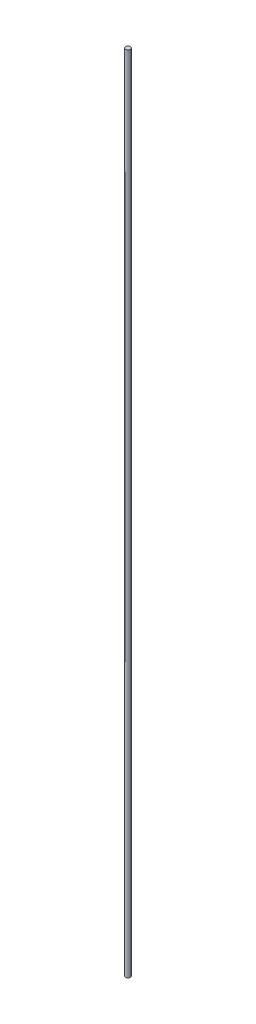
ISO-10303-21;
HEADER;
FILE_DESCRIPTION(('STEP AP214'),'2;1');
FILE_NAME('part.step','',(''),(''),'','','');
FILE_SCHEMA(('AUTOMOTIVE_DESIGN { 1 0 10303 214 1 1 1 1 }'));
ENDSEC;
DATA;
#1=APPLICATION_CONTEXT('core data for automotive mechanical design processes');
#2=APPLICATION_PROTOCOL_DEFINITION('international standard','automotive_design',2000,#1);
#3=PRODUCT_CONTEXT('',#1,'mechanical');
#4=PRODUCT('Part','Part','',(#3));
#5=PRODUCT_RELATED_PRODUCT_CATEGORY('part','',(#4));
#6=PRODUCT_DEFINITION_FORMATION('','',#4);
#7=PRODUCT_DEFINITION_CONTEXT('part definition',#1,'design');
#8=PRODUCT_DEFINITION('design','',#6,#7);
#9=PRODUCT_DEFINITION_SHAPE('','',#8);
#10=(LENGTH_UNIT() NAMED_UNIT(*) SI_UNIT(.MILLI.,.METRE.));
#11=(NAMED_UNIT(*) PLANE_ANGLE_UNIT() SI_UNIT($,.RADIAN.));
#12=(NAMED_UNIT(*) SI_UNIT($,.STERADIAN.) SOLID_ANGLE_UNIT());
#13=UNCERTAINTY_MEASURE_WITH_UNIT(LENGTH_MEASURE(1.E-05),#10,'distance_accuracy_value','');
#14=(GEOMETRIC_REPRESENTATION_CONTEXT(3) GLOBAL_UNCERTAINTY_ASSIGNED_CONTEXT((#13)) GLOBAL_UNIT_ASSIGNED_CONTEXT((#10,
#11,#12)) REPRESENTATION_CONTEXT('',''));
#15=CARTESIAN_POINT('',(0.,0.,0.));
#16=DIRECTION('',(0.,0.,1.));
#17=DIRECTION('',(1.,0.,0.));
#18=AXIS2_PLACEMENT_3D('',#15,#16,#17);
#19=CARTESIAN_POINT('',(0.,0.,0.));
#20=DIRECTION('',(0.,1.,0.));
#21=DIRECTION('',(0.,0.,1.));
#22=AXIS2_PLACEMENT_3D('',#19,#20,#21);
#23=PLANE('',#22);
#24=CARTESIAN_POINT('',(0.,0.,0.));
#25=DIRECTION('',(0.,1.,0.));
#26=DIRECTION('',(0.,0.,1.));
#27=AXIS2_PLACEMENT_3D('',#24,#25,#26);
#28=CIRCLE('',#27,6.35);
#29=CARTESIAN_POINT('',(0.,0.,6.35));
#30=VERTEX_POINT('',#29);
#31=EDGE_CURVE('E51',#30,#30,#28,.T.);
#32=ORIENTED_EDGE('',*,*,#31,.F.);
#33=EDGE_LOOP('',(#32));
#34=FACE_BOUND('',#33,.T.);
#35=ADVANCED_FACE('F44',(#34),#23,.F.);
#36=CARTESIAN_POINT('',(-1.3855583347322E-10,2095.246,0.));
#37=DIRECTION('',(0.,1.,0.));
#38=DIRECTION('',(0.,0.,1.));
#39=AXIS2_PLACEMENT_3D('',#36,#37,#38);
#40=PLANE('',#39);
#41=CARTESIAN_POINT('',(-1.3855583347322E-10,2095.246,0.));
#42=DIRECTION('',(0.,1.,0.));
#43=DIRECTION('',(0.,0.,1.));
#44=AXIS2_PLACEMENT_3D('',#41,#42,#43);
#45=CIRCLE('',#44,6.35);
#46=CARTESIAN_POINT('',(-1.3855583347322E-10,2095.246,6.35));
#47=VERTEX_POINT('',#46);
#48=EDGE_CURVE('E11',#47,#47,#45,.T.);
#49=ORIENTED_EDGE('',*,*,#48,.T.);
#50=EDGE_LOOP('',(#49));
#51=FACE_BOUND('',#50,.T.);
#52=ADVANCED_FACE('F63',(#51),#40,.T.);
#53=CARTESIAN_POINT('',(0.,0.,0.));
#54=DIRECTION('',(0.,1.,0.));
#55=DIRECTION('',(0.,0.,1.));
#56=AXIS2_PLACEMENT_3D('',#53,#54,#55);
#57=CYLINDRICAL_SURFACE('',#56,6.35);
#58=ORIENTED_EDGE('',*,*,#48,.F.);
#59=EDGE_LOOP('',(#58));
#60=FACE_BOUND('',#59,.T.);
#61=ORIENTED_EDGE('',*,*,#31,.T.);
#62=EDGE_LOOP('',(#61));
#63=FACE_BOUND('',#62,.T.);
#64=ADVANCED_FACE('F60',(#60,#63),#57,.T.);
#65=CLOSED_SHELL('',(#35,#52,#64));
#66=MANIFOLD_SOLID_BREP('B2',#65);
#67=ADVANCED_BREP_SHAPE_REPRESENTATION('',(#18,#66),#14);
#68=SHAPE_DEFINITION_REPRESENTATION(#9,#67);
ENDSEC;
END-ISO-10303-21;
